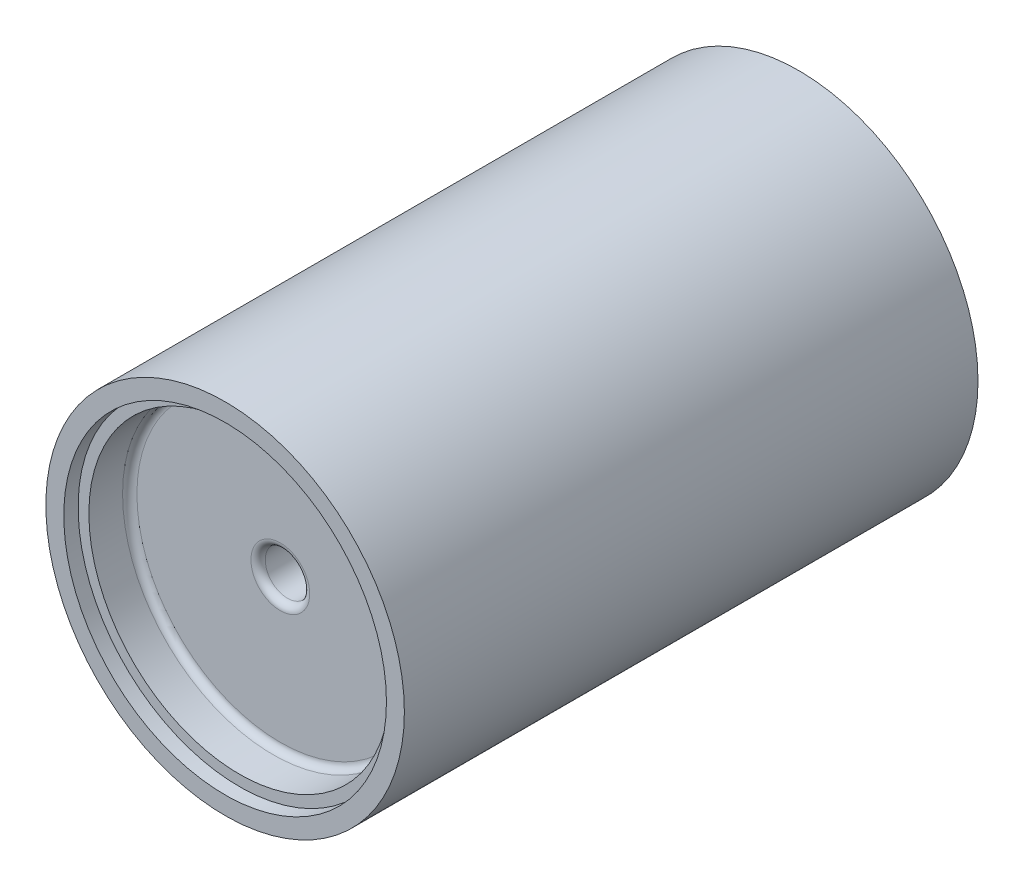
ISO-10303-21;
HEADER;
FILE_DESCRIPTION(('STEP AP214'),'2;1');
FILE_NAME('part.step','',(''),(''),'','','');
FILE_SCHEMA(('AUTOMOTIVE_DESIGN { 1 0 10303 214 1 1 1 1 }'));
ENDSEC;
DATA;
#1=APPLICATION_CONTEXT('core data for automotive mechanical design processes');
#2=APPLICATION_PROTOCOL_DEFINITION('international standard','automotive_design',2000,#1);
#3=PRODUCT_CONTEXT('',#1,'mechanical');
#4=PRODUCT('Part','Part','',(#3));
#5=PRODUCT_RELATED_PRODUCT_CATEGORY('part','',(#4));
#6=PRODUCT_DEFINITION_FORMATION('','',#4);
#7=PRODUCT_DEFINITION_CONTEXT('part definition',#1,'design');
#8=PRODUCT_DEFINITION('design','',#6,#7);
#9=PRODUCT_DEFINITION_SHAPE('','',#8);
#10=(LENGTH_UNIT() NAMED_UNIT(*) SI_UNIT(.MILLI.,.METRE.));
#11=(NAMED_UNIT(*) PLANE_ANGLE_UNIT() SI_UNIT($,.RADIAN.));
#12=(NAMED_UNIT(*) SI_UNIT($,.STERADIAN.) SOLID_ANGLE_UNIT());
#13=UNCERTAINTY_MEASURE_WITH_UNIT(LENGTH_MEASURE(1.E-05),#10,'distance_accuracy_value','');
#14=(GEOMETRIC_REPRESENTATION_CONTEXT(3) GLOBAL_UNCERTAINTY_ASSIGNED_CONTEXT((#13)) GLOBAL_UNIT_ASSIGNED_CONTEXT((#10,
#11,#12)) REPRESENTATION_CONTEXT('',''));
#15=CARTESIAN_POINT('',(0.,0.,0.));
#16=DIRECTION('',(0.,0.,1.));
#17=DIRECTION('',(1.,0.,0.));
#18=AXIS2_PLACEMENT_3D('',#15,#16,#17);
#19=CARTESIAN_POINT('',(0.,0.,-32.3));
#20=DIRECTION('',(0.,0.,-1.));
#21=DIRECTION('',(-1.,0.,0.));
#22=AXIS2_PLACEMENT_3D('',#19,#20,#21);
#23=CYLINDRICAL_SURFACE('',#22,21.);
#24=CARTESIAN_POINT('',(0.,0.,-33.3));
#25=DIRECTION('',(0.,0.,-1.));
#26=DIRECTION('',(-1.,0.,0.));
#27=AXIS2_PLACEMENT_3D('',#24,#25,#26);
#28=CIRCLE('',#27,21.);
#29=CARTESIAN_POINT('',(-21.,0.,-33.3));
#30=VERTEX_POINT('',#29);
#31=EDGE_CURVE('E48',#30,#30,#28,.F.);
#32=CARTESIAN_POINT('',(0.,0.,-38.));
#33=DIRECTION('',(0.,0.,-1.));
#34=DIRECTION('',(-1.,0.,0.));
#35=AXIS2_PLACEMENT_3D('',#32,#33,#34);
#36=CIRCLE('',#35,21.);
#37=CARTESIAN_POINT('',(-21.,0.,-38.));
#38=VERTEX_POINT('',#37);
#39=EDGE_CURVE('E92',#38,#38,#36,.T.);
#40=CARTESIAN_POINT('',(-21.,0.,-33.3));
#41=CARTESIAN_POINT('',(-21.,0.,-33.3489583333333));
#42=CARTESIAN_POINT('',(-21.,0.,-33.3979166666667));
#43=CARTESIAN_POINT('',(-21.,0.,-33.4958333333333));
#44=CARTESIAN_POINT('',(-21.,0.,-33.5447916666667));
#45=CARTESIAN_POINT('',(-21.,0.,-33.6427083333333));
#46=CARTESIAN_POINT('',(-21.,0.,-33.6916666666667));
#47=CARTESIAN_POINT('',(-21.,0.,-33.7895833333333));
#48=CARTESIAN_POINT('',(-21.,0.,-33.8385416666667));
#49=CARTESIAN_POINT('',(-21.,0.,-33.9364583333333));
#50=CARTESIAN_POINT('',(-21.,0.,-33.9854166666667));
#51=CARTESIAN_POINT('',(-21.,0.,-34.0833333333333));
#52=CARTESIAN_POINT('',(-21.,0.,-34.1322916666667));
#53=CARTESIAN_POINT('',(-21.,0.,-34.2302083333333));
#54=CARTESIAN_POINT('',(-21.,0.,-34.2791666666667));
#55=CARTESIAN_POINT('',(-21.,0.,-34.3770833333333));
#56=CARTESIAN_POINT('',(-21.,0.,-34.4260416666667));
#57=CARTESIAN_POINT('',(-21.,0.,-34.5239583333333));
#58=CARTESIAN_POINT('',(-21.,0.,-34.5729166666667));
#59=CARTESIAN_POINT('',(-21.,0.,-34.6708333333333));
#60=CARTESIAN_POINT('',(-21.,0.,-34.7197916666667));
#61=CARTESIAN_POINT('',(-21.,0.,-34.8177083333333));
#62=CARTESIAN_POINT('',(-21.,0.,-34.8666666666667));
#63=CARTESIAN_POINT('',(-21.,0.,-34.9645833333333));
#64=CARTESIAN_POINT('',(-21.,0.,-35.0135416666667));
#65=CARTESIAN_POINT('',(-21.,0.,-35.1114583333333));
#66=CARTESIAN_POINT('',(-21.,0.,-35.1604166666667));
#67=CARTESIAN_POINT('',(-21.,0.,-35.2583333333333));
#68=CARTESIAN_POINT('',(-21.,0.,-35.3072916666667));
#69=CARTESIAN_POINT('',(-21.,0.,-35.4052083333333));
#70=CARTESIAN_POINT('',(-21.,0.,-35.4541666666667));
#71=CARTESIAN_POINT('',(-21.,0.,-35.5520833333333));
#72=CARTESIAN_POINT('',(-21.,0.,-35.6010416666667));
#73=CARTESIAN_POINT('',(-21.,0.,-35.6989583333333));
#74=CARTESIAN_POINT('',(-21.,0.,-35.7479166666667));
#75=CARTESIAN_POINT('',(-21.,0.,-35.8458333333333));
#76=CARTESIAN_POINT('',(-21.,0.,-35.8947916666667));
#77=CARTESIAN_POINT('',(-21.,0.,-35.9927083333333));
#78=CARTESIAN_POINT('',(-21.,0.,-36.0416666666667));
#79=CARTESIAN_POINT('',(-21.,0.,-36.1395833333333));
#80=CARTESIAN_POINT('',(-21.,0.,-36.1885416666667));
#81=CARTESIAN_POINT('',(-21.,0.,-36.2864583333333));
#82=CARTESIAN_POINT('',(-21.,0.,-36.3354166666667));
#83=CARTESIAN_POINT('',(-21.,0.,-36.4333333333333));
#84=CARTESIAN_POINT('',(-21.,0.,-36.4822916666667));
#85=CARTESIAN_POINT('',(-21.,0.,-36.5802083333333));
#86=CARTESIAN_POINT('',(-21.,0.,-36.6291666666667));
#87=CARTESIAN_POINT('',(-21.,0.,-36.7270833333333));
#88=CARTESIAN_POINT('',(-21.,0.,-36.7760416666667));
#89=CARTESIAN_POINT('',(-21.,0.,-36.8739583333333));
#90=CARTESIAN_POINT('',(-21.,0.,-36.9229166666667));
#91=CARTESIAN_POINT('',(-21.,0.,-37.0208333333333));
#92=CARTESIAN_POINT('',(-21.,0.,-37.0697916666667));
#93=CARTESIAN_POINT('',(-21.,0.,-37.1677083333333));
#94=CARTESIAN_POINT('',(-21.,0.,-37.2166666666667));
#95=CARTESIAN_POINT('',(-21.,0.,-37.3145833333333));
#96=CARTESIAN_POINT('',(-21.,0.,-37.3635416666667));
#97=CARTESIAN_POINT('',(-21.,0.,-37.4614583333333));
#98=CARTESIAN_POINT('',(-21.,0.,-37.5104166666667));
#99=CARTESIAN_POINT('',(-21.,0.,-37.6083333333333));
#100=CARTESIAN_POINT('',(-21.,0.,-37.6572916666667));
#101=CARTESIAN_POINT('',(-21.,0.,-37.7552083333333));
#102=CARTESIAN_POINT('',(-21.,0.,-37.8041666666667));
#103=CARTESIAN_POINT('',(-21.,0.,-37.9020833333333));
#104=CARTESIAN_POINT('',(-21.,0.,-37.9510416666667));
#105=CARTESIAN_POINT('',(-21.,0.,-38.));
#106=B_SPLINE_CURVE_WITH_KNOTS('',3,(#40,#41,#42,#43,#44,#45,#46,#47,#48,#49,#50,#51,#52,#53,
#54,#55,#56,#57,#58,#59,#60,#61,#62,#63,#64,#65,#66,#67,#68,#69,#70,#71,#72,#73,#74,#75,#76,#77,
#78,#79,#80,#81,#82,#83,#84,#85,#86,#87,#88,#89,#90,#91,#92,#93,#94,#95,#96,#97,#98,#99,#100,
#101,#102,#103,#104,#105),.UNSPECIFIED.,.F.,.F.,(4,2,2,2,2,2,2,2,2,2,2,2,2,2,2,2,2,2,2,2,2,2,2,
2,2,2,2,2,2,2,2,2,4),(0.,0.146874999999998,0.293749999999995,0.440624999999993,
0.587499999999998,0.734374999999995,0.881249999999993,1.028125,1.175,1.32187499999999,1.46875,
1.615625,1.76249999999999,1.909375,2.05625,2.20312499999999,2.35,2.496875,2.64374999999999,
2.790625,2.9375,3.08437499999999,3.23125,3.378125,3.52499999999999,3.67187499999999,3.81875,
3.96562499999999,4.11249999999999,4.259375,4.40624999999999,4.55312499999999,4.7),.UNSPECIFIED.);
#107=EDGE_CURVE('BSEAM41',#30,#38,#106,.T.);
#108=ORIENTED_EDGE('',*,*,#31,.T.);
#109=ORIENTED_EDGE('',*,*,#39,.T.);
#110=ORIENTED_EDGE('',*,*,#107,.T.);
#111=ORIENTED_EDGE('',*,*,#107,.F.);
#112=EDGE_LOOP('',(#108,#110,#109,#111));
#113=FACE_BOUND('',#112,.T.);
#114=ADVANCED_FACE('F41',(#113),#23,.F.);
#115=CARTESIAN_POINT('',(0.,0.,32.3));
#116=DIRECTION('',(0.,0.,1.));
#117=DIRECTION('',(1.,0.,0.));
#118=AXIS2_PLACEMENT_3D('',#115,#116,#117);
#119=CYLINDRICAL_SURFACE('',#118,21.);
#120=CARTESIAN_POINT('',(0.,0.,33.3));
#121=DIRECTION('',(0.,0.,1.));
#122=DIRECTION('',(1.,0.,0.));
#123=AXIS2_PLACEMENT_3D('',#120,#121,#122);
#124=CIRCLE('',#123,21.);
#125=CARTESIAN_POINT('',(21.,0.,33.3));
#126=VERTEX_POINT('',#125);
#127=EDGE_CURVE('E10',#126,#126,#124,.F.);
#128=CARTESIAN_POINT('',(0.,0.,38.));
#129=DIRECTION('',(0.,0.,1.));
#130=DIRECTION('',(1.,0.,0.));
#131=AXIS2_PLACEMENT_3D('',#128,#129,#130);
#132=CIRCLE('',#131,21.);
#133=CARTESIAN_POINT('',(21.,0.,38.));
#134=VERTEX_POINT('',#133);
#135=EDGE_CURVE('E83',#134,#134,#132,.T.);
#136=CARTESIAN_POINT('',(21.,0.,33.3));
#137=CARTESIAN_POINT('',(21.,0.,33.3489583333333));
#138=CARTESIAN_POINT('',(21.,0.,33.3979166666667));
#139=CARTESIAN_POINT('',(21.,0.,33.4958333333333));
#140=CARTESIAN_POINT('',(21.,0.,33.5447916666667));
#141=CARTESIAN_POINT('',(21.,0.,33.6427083333333));
#142=CARTESIAN_POINT('',(21.,0.,33.6916666666667));
#143=CARTESIAN_POINT('',(21.,0.,33.7895833333333));
#144=CARTESIAN_POINT('',(21.,0.,33.8385416666667));
#145=CARTESIAN_POINT('',(21.,0.,33.9364583333333));
#146=CARTESIAN_POINT('',(21.,0.,33.9854166666667));
#147=CARTESIAN_POINT('',(21.,0.,34.0833333333333));
#148=CARTESIAN_POINT('',(21.,0.,34.1322916666667));
#149=CARTESIAN_POINT('',(21.,0.,34.2302083333333));
#150=CARTESIAN_POINT('',(21.,0.,34.2791666666667));
#151=CARTESIAN_POINT('',(21.,0.,34.3770833333333));
#152=CARTESIAN_POINT('',(21.,0.,34.4260416666667));
#153=CARTESIAN_POINT('',(21.,0.,34.5239583333333));
#154=CARTESIAN_POINT('',(21.,0.,34.5729166666667));
#155=CARTESIAN_POINT('',(21.,0.,34.6708333333333));
#156=CARTESIAN_POINT('',(21.,0.,34.7197916666667));
#157=CARTESIAN_POINT('',(21.,0.,34.8177083333333));
#158=CARTESIAN_POINT('',(21.,0.,34.8666666666667));
#159=CARTESIAN_POINT('',(21.,0.,34.9645833333333));
#160=CARTESIAN_POINT('',(21.,0.,35.0135416666667));
#161=CARTESIAN_POINT('',(21.,0.,35.1114583333333));
#162=CARTESIAN_POINT('',(21.,0.,35.1604166666667));
#163=CARTESIAN_POINT('',(21.,0.,35.2583333333333));
#164=CARTESIAN_POINT('',(21.,0.,35.3072916666667));
#165=CARTESIAN_POINT('',(21.,0.,35.4052083333333));
#166=CARTESIAN_POINT('',(21.,0.,35.4541666666667));
#167=CARTESIAN_POINT('',(21.,0.,35.5520833333333));
#168=CARTESIAN_POINT('',(21.,0.,35.6010416666667));
#169=CARTESIAN_POINT('',(21.,0.,35.6989583333333));
#170=CARTESIAN_POINT('',(21.,0.,35.7479166666667));
#171=CARTESIAN_POINT('',(21.,0.,35.8458333333333));
#172=CARTESIAN_POINT('',(21.,0.,35.8947916666667));
#173=CARTESIAN_POINT('',(21.,0.,35.9927083333333));
#174=CARTESIAN_POINT('',(21.,0.,36.0416666666667));
#175=CARTESIAN_POINT('',(21.,0.,36.1395833333333));
#176=CARTESIAN_POINT('',(21.,0.,36.1885416666667));
#177=CARTESIAN_POINT('',(21.,0.,36.2864583333333));
#178=CARTESIAN_POINT('',(21.,0.,36.3354166666667));
#179=CARTESIAN_POINT('',(21.,0.,36.4333333333333));
#180=CARTESIAN_POINT('',(21.,0.,36.4822916666667));
#181=CARTESIAN_POINT('',(21.,0.,36.5802083333333));
#182=CARTESIAN_POINT('',(21.,0.,36.6291666666667));
#183=CARTESIAN_POINT('',(21.,0.,36.7270833333333));
#184=CARTESIAN_POINT('',(21.,0.,36.7760416666667));
#185=CARTESIAN_POINT('',(21.,0.,36.8739583333333));
#186=CARTESIAN_POINT('',(21.,0.,36.9229166666667));
#187=CARTESIAN_POINT('',(21.,0.,37.0208333333333));
#188=CARTESIAN_POINT('',(21.,0.,37.0697916666667));
#189=CARTESIAN_POINT('',(21.,0.,37.1677083333333));
#190=CARTESIAN_POINT('',(21.,0.,37.2166666666667));
#191=CARTESIAN_POINT('',(21.,0.,37.3145833333333));
#192=CARTESIAN_POINT('',(21.,0.,37.3635416666667));
#193=CARTESIAN_POINT('',(21.,0.,37.4614583333333));
#194=CARTESIAN_POINT('',(21.,0.,37.5104166666667));
#195=CARTESIAN_POINT('',(21.,0.,37.6083333333333));
#196=CARTESIAN_POINT('',(21.,0.,37.6572916666667));
#197=CARTESIAN_POINT('',(21.,0.,37.7552083333333));
#198=CARTESIAN_POINT('',(21.,0.,37.8041666666667));
#199=CARTESIAN_POINT('',(21.,0.,37.9020833333333));
#200=CARTESIAN_POINT('',(21.,0.,37.9510416666667));
#201=CARTESIAN_POINT('',(21.,0.,38.));
#202=B_SPLINE_CURVE_WITH_KNOTS('',3,(#136,#137,#138,#139,#140,#141,#142,#143,#144,#145,#146,
#147,#148,#149,#150,#151,#152,#153,#154,#155,#156,#157,#158,#159,#160,#161,#162,#163,#164,#165,
#166,#167,#168,#169,#170,#171,#172,#173,#174,#175,#176,#177,#178,#179,#180,#181,#182,#183,#184,
#185,#186,#187,#188,#189,#190,#191,#192,#193,#194,#195,#196,#197,#198,#199,#200,#201),
.UNSPECIFIED.,.F.,.F.,(4,2,2,2,2,2,2,2,2,2,2,2,2,2,2,2,2,2,2,2,2,2,2,2,2,2,2,2,2,2,2,2,4),(0.,
0.146874999999998,0.293749999999995,0.440624999999993,0.587499999999998,0.734374999999995,
0.881249999999993,1.028125,1.175,1.32187499999999,1.46875,1.615625,1.76249999999999,1.909375,
2.05625,2.20312499999999,2.35,2.496875,2.64374999999999,2.790625,2.9375,3.08437499999999,
3.23125,3.378125,3.52499999999999,3.67187499999999,3.81875,3.96562499999999,4.11249999999999,
4.259375,4.40624999999999,4.55312499999999,4.7),.UNSPECIFIED.);
#203=EDGE_CURVE('BSEAM133',#126,#134,#202,.T.);
#204=ORIENTED_EDGE('',*,*,#127,.T.);
#205=ORIENTED_EDGE('',*,*,#135,.T.);
#206=ORIENTED_EDGE('',*,*,#203,.T.);
#207=ORIENTED_EDGE('',*,*,#203,.F.);
#208=EDGE_LOOP('',(#204,#206,#205,#207));
#209=FACE_BOUND('',#208,.T.);
#210=ADVANCED_FACE('F133',(#209),#119,.F.);
#211=CARTESIAN_POINT('',(0.,0.,40.));
#212=DIRECTION('',(0.,0.,-1.));
#213=DIRECTION('',(-1.,0.,0.));
#214=AXIS2_PLACEMENT_3D('',#211,#212,#213);
#215=CYLINDRICAL_SURFACE('',#214,3.1);
#216=CARTESIAN_POINT('',(0.,0.,-31.3));
#217=DIRECTION('',(0.,0.,-1.));
#218=DIRECTION('',(-1.,0.,0.));
#219=AXIS2_PLACEMENT_3D('',#216,#217,#218);
#220=CIRCLE('',#219,3.1);
#221=CARTESIAN_POINT('',(-3.1,0.,-31.3));
#222=VERTEX_POINT('',#221);
#223=EDGE_CURVE('E67',#222,#222,#220,.T.);
#224=ORIENTED_EDGE('',*,*,#223,.T.);
#225=EDGE_LOOP('',(#224));
#226=FACE_BOUND('',#225,.T.);
#227=CARTESIAN_POINT('',(0.,0.,31.3));
#228=DIRECTION('',(0.,0.,1.));
#229=DIRECTION('',(1.,0.,0.));
#230=AXIS2_PLACEMENT_3D('',#227,#228,#229);
#231=CIRCLE('',#230,3.1);
#232=CARTESIAN_POINT('',(3.1,0.,31.3));
#233=VERTEX_POINT('',#232);
#234=EDGE_CURVE('E70',#233,#233,#231,.T.);
#235=ORIENTED_EDGE('',*,*,#234,.T.);
#236=EDGE_LOOP('',(#235));
#237=FACE_BOUND('',#236,.T.);
#238=ADVANCED_FACE('F138',(#226,#237),#215,.F.);
#239=CARTESIAN_POINT('',(0.,0.,40.));
#240=DIRECTION('',(0.,0.,1.));
#241=DIRECTION('',(1.,0.,0.));
#242=AXIS2_PLACEMENT_3D('',#239,#240,#241);
#243=PLANE('',#242);
#244=CARTESIAN_POINT('',(0.,0.,40.));
#245=DIRECTION('',(0.,0.,1.));
#246=DIRECTION('',(1.,0.,0.));
#247=AXIS2_PLACEMENT_3D('',#244,#245,#246);
#248=CIRCLE('',#247,22.5);
#249=CARTESIAN_POINT('',(22.5,0.,40.));
#250=VERTEX_POINT('',#249);
#251=EDGE_CURVE('E80',#250,#250,#248,.T.);
#252=ORIENTED_EDGE('',*,*,#251,.F.);
#253=EDGE_LOOP('',(#252));
#254=FACE_BOUND('',#253,.T.);
#255=CARTESIAN_POINT('',(0.,0.,40.));
#256=DIRECTION('',(0.,0.,1.));
#257=DIRECTION('',(1.,0.,0.));
#258=AXIS2_PLACEMENT_3D('',#255,#256,#257);
#259=CIRCLE('',#258,25.);
#260=CARTESIAN_POINT('',(25.,0.,40.));
#261=VERTEX_POINT('',#260);
#262=EDGE_CURVE('E73',#261,#261,#259,.T.);
#263=ORIENTED_EDGE('',*,*,#262,.T.);
#264=EDGE_LOOP('',(#263));
#265=FACE_BOUND('',#264,.T.);
#266=ADVANCED_FACE('F116',(#254,#265),#243,.T.);
#267=CARTESIAN_POINT('',(0.,0.,-40.));
#268=DIRECTION('',(0.,0.,1.));
#269=DIRECTION('',(1.,0.,0.));
#270=AXIS2_PLACEMENT_3D('',#267,#268,#269);
#271=PLANE('',#270);
#272=CARTESIAN_POINT('',(0.,0.,-40.));
#273=DIRECTION('',(0.,0.,-1.));
#274=DIRECTION('',(-1.,0.,0.));
#275=AXIS2_PLACEMENT_3D('',#272,#273,#274);
#276=CIRCLE('',#275,22.5);
#277=CARTESIAN_POINT('',(-22.5,0.,-40.));
#278=VERTEX_POINT('',#277);
#279=EDGE_CURVE('E89',#278,#278,#276,.T.);
#280=ORIENTED_EDGE('',*,*,#279,.F.);
#281=EDGE_LOOP('',(#280));
#282=FACE_BOUND('',#281,.T.);
#283=CARTESIAN_POINT('',(0.,0.,-40.));
#284=DIRECTION('',(0.,0.,1.));
#285=DIRECTION('',(1.,0.,0.));
#286=AXIS2_PLACEMENT_3D('',#283,#284,#285);
#287=CIRCLE('',#286,25.);
#288=CARTESIAN_POINT('',(25.,0.,-40.));
#289=VERTEX_POINT('',#288);
#290=EDGE_CURVE('E74',#289,#289,#287,.T.);
#291=ORIENTED_EDGE('',*,*,#290,.F.);
#292=EDGE_LOOP('',(#291));
#293=FACE_BOUND('',#292,.T.);
#294=ADVANCED_FACE('F112',(#282,#293),#271,.F.);
#295=CARTESIAN_POINT('',(0.,0.,40.));
#296=DIRECTION('',(0.,0.,-1.));
#297=DIRECTION('',(-1.,0.,0.));
#298=AXIS2_PLACEMENT_3D('',#295,#296,#297);
#299=CYLINDRICAL_SURFACE('',#298,25.);
#300=ORIENTED_EDGE('',*,*,#262,.F.);
#301=EDGE_LOOP('',(#300));
#302=FACE_BOUND('',#301,.T.);
#303=ORIENTED_EDGE('',*,*,#290,.T.);
#304=EDGE_LOOP('',(#303));
#305=FACE_BOUND('',#304,.T.);
#306=ADVANCED_FACE('F115',(#302,#305),#299,.T.);
#307=CARTESIAN_POINT('',(0.,0.,32.3));
#308=DIRECTION('',(0.,0.,1.));
#309=DIRECTION('',(1.,0.,0.));
#310=AXIS2_PLACEMENT_3D('',#307,#308,#309);
#311=PLANE('',#310);
#312=CARTESIAN_POINT('',(0.,0.,32.3));
#313=DIRECTION('',(0.,0.,1.));
#314=DIRECTION('',(1.,0.,0.));
#315=AXIS2_PLACEMENT_3D('',#312,#313,#314);
#316=CIRCLE('',#315,4.1);
#317=CARTESIAN_POINT('',(4.1,0.,32.3));
#318=VERTEX_POINT('',#317);
#319=EDGE_CURVE('E52',#318,#318,#316,.F.);
#320=ORIENTED_EDGE('',*,*,#319,.T.);
#321=EDGE_LOOP('',(#320));
#322=FACE_BOUND('',#321,.T.);
#323=CARTESIAN_POINT('',(0.,0.,32.3));
#324=DIRECTION('',(0.,0.,1.));
#325=DIRECTION('',(1.,0.,0.));
#326=AXIS2_PLACEMENT_3D('',#323,#324,#325);
#327=CIRCLE('',#326,20.);
#328=CARTESIAN_POINT('',(20.,0.,32.3));
#329=VERTEX_POINT('',#328);
#330=EDGE_CURVE('E56',#329,#329,#327,.T.);
#331=ORIENTED_EDGE('',*,*,#330,.T.);
#332=EDGE_LOOP('',(#331));
#333=FACE_BOUND('',#332,.T.);
#334=ADVANCED_FACE('F121',(#322,#333),#311,.T.);
#335=CARTESIAN_POINT('',(0.,0.,-32.3));
#336=DIRECTION('',(0.,0.,-1.));
#337=DIRECTION('',(-1.,0.,0.));
#338=AXIS2_PLACEMENT_3D('',#335,#336,#337);
#339=PLANE('',#338);
#340=CARTESIAN_POINT('',(0.,0.,-32.3));
#341=DIRECTION('',(0.,0.,-1.));
#342=DIRECTION('',(-1.,0.,0.));
#343=AXIS2_PLACEMENT_3D('',#340,#341,#342);
#344=CIRCLE('',#343,4.1);
#345=CARTESIAN_POINT('',(-4.1,0.,-32.3));
#346=VERTEX_POINT('',#345);
#347=EDGE_CURVE('E61',#346,#346,#344,.F.);
#348=ORIENTED_EDGE('',*,*,#347,.T.);
#349=EDGE_LOOP('',(#348));
#350=FACE_BOUND('',#349,.T.);
#351=CARTESIAN_POINT('',(0.,0.,-32.3));
#352=DIRECTION('',(0.,0.,-1.));
#353=DIRECTION('',(-1.,0.,0.));
#354=AXIS2_PLACEMENT_3D('',#351,#352,#353);
#355=CIRCLE('',#354,20.);
#356=CARTESIAN_POINT('',(-20.,0.,-32.3));
#357=VERTEX_POINT('',#356);
#358=EDGE_CURVE('E64',#357,#357,#355,.T.);
#359=ORIENTED_EDGE('',*,*,#358,.T.);
#360=EDGE_LOOP('',(#359));
#361=FACE_BOUND('',#360,.T.);
#362=ADVANCED_FACE('F127',(#350,#361),#339,.T.);
#363=CARTESIAN_POINT('',(0.,0.,-31.3));
#364=DIRECTION('',(0.,0.,-1.));
#365=DIRECTION('',(-1.,0.,0.));
#366=AXIS2_PLACEMENT_3D('',#363,#364,#365);
#367=TOROIDAL_SURFACE('',#366,4.1,1.);
#368=ORIENTED_EDGE('',*,*,#347,.F.);
#369=EDGE_LOOP('',(#368));
#370=FACE_BOUND('',#369,.T.);
#371=ORIENTED_EDGE('',*,*,#223,.F.);
#372=EDGE_LOOP('',(#371));
#373=FACE_BOUND('',#372,.T.);
#374=ADVANCED_FACE('F177',(#370,#373),#367,.T.);
#375=CARTESIAN_POINT('',(0.,0.,31.3));
#376=DIRECTION('',(0.,0.,1.));
#377=DIRECTION('',(1.,0.,0.));
#378=AXIS2_PLACEMENT_3D('',#375,#376,#377);
#379=TOROIDAL_SURFACE('',#378,4.1,1.);
#380=ORIENTED_EDGE('',*,*,#319,.F.);
#381=EDGE_LOOP('',(#380));
#382=FACE_BOUND('',#381,.T.);
#383=ORIENTED_EDGE('',*,*,#234,.F.);
#384=EDGE_LOOP('',(#383));
#385=FACE_BOUND('',#384,.T.);
#386=ADVANCED_FACE('F169',(#382,#385),#379,.T.);
#387=CARTESIAN_POINT('',(0.,0.,-33.3));
#388=DIRECTION('',(0.,0.,-1.));
#389=DIRECTION('',(-1.,0.,0.));
#390=AXIS2_PLACEMENT_3D('',#387,#388,#389);
#391=TOROIDAL_SURFACE('',#390,20.,1.);
#392=ORIENTED_EDGE('',*,*,#31,.F.);
#393=EDGE_LOOP('',(#392));
#394=FACE_BOUND('',#393,.T.);
#395=ORIENTED_EDGE('',*,*,#358,.F.);
#396=EDGE_LOOP('',(#395));
#397=FACE_BOUND('',#396,.T.);
#398=ADVANCED_FACE('F162',(#394,#397),#391,.F.);
#399=CARTESIAN_POINT('',(0.,0.,33.3));
#400=DIRECTION('',(0.,0.,1.));
#401=DIRECTION('',(1.,0.,0.));
#402=AXIS2_PLACEMENT_3D('',#399,#400,#401);
#403=TOROIDAL_SURFACE('',#402,20.,1.);
#404=ORIENTED_EDGE('',*,*,#127,.F.);
#405=EDGE_LOOP('',(#404));
#406=FACE_BOUND('',#405,.T.);
#407=ORIENTED_EDGE('',*,*,#330,.F.);
#408=EDGE_LOOP('',(#407));
#409=FACE_BOUND('',#408,.T.);
#410=ADVANCED_FACE('F43',(#406,#409),#403,.F.);
#411=CARTESIAN_POINT('',(0.,0.,38.));
#412=DIRECTION('',(0.,0.,1.));
#413=DIRECTION('',(1.,0.,0.));
#414=AXIS2_PLACEMENT_3D('',#411,#412,#413);
#415=CYLINDRICAL_SURFACE('',#414,22.5);
#416=CARTESIAN_POINT('',(0.,0.,38.));
#417=DIRECTION('',(0.,0.,1.));
#418=DIRECTION('',(1.,0.,0.));
#419=AXIS2_PLACEMENT_3D('',#416,#417,#418);
#420=CIRCLE('',#419,22.5);
#421=CARTESIAN_POINT('',(22.5,0.,38.));
#422=VERTEX_POINT('',#421);
#423=EDGE_CURVE('E77',#422,#422,#420,.T.);
#424=ORIENTED_EDGE('',*,*,#423,.F.);
#425=EDGE_LOOP('',(#424));
#426=FACE_BOUND('',#425,.T.);
#427=ORIENTED_EDGE('',*,*,#251,.T.);
#428=EDGE_LOOP('',(#427));
#429=FACE_BOUND('',#428,.T.);
#430=ADVANCED_FACE('F153',(#426,#429),#415,.F.);
#431=CARTESIAN_POINT('',(0.,0.,38.));
#432=DIRECTION('',(0.,0.,1.));
#433=DIRECTION('',(1.,0.,0.));
#434=AXIS2_PLACEMENT_3D('',#431,#432,#433);
#435=PLANE('',#434);
#436=ORIENTED_EDGE('',*,*,#135,.F.);
#437=EDGE_LOOP('',(#436));
#438=FACE_BOUND('',#437,.T.);
#439=ORIENTED_EDGE('',*,*,#423,.T.);
#440=EDGE_LOOP('',(#439));
#441=FACE_BOUND('',#440,.T.);
#442=ADVANCED_FACE('F108',(#438,#441),#435,.T.);
#443=CARTESIAN_POINT('',(0.,0.,-38.));
#444=DIRECTION('',(0.,0.,-1.));
#445=DIRECTION('',(-1.,0.,0.));
#446=AXIS2_PLACEMENT_3D('',#443,#444,#445);
#447=CYLINDRICAL_SURFACE('',#446,22.5);
#448=CARTESIAN_POINT('',(0.,0.,-38.));
#449=DIRECTION('',(0.,0.,-1.));
#450=DIRECTION('',(-1.,0.,0.));
#451=AXIS2_PLACEMENT_3D('',#448,#449,#450);
#452=CIRCLE('',#451,22.5);
#453=CARTESIAN_POINT('',(-22.5,0.,-38.));
#454=VERTEX_POINT('',#453);
#455=EDGE_CURVE('E88',#454,#454,#452,.T.);
#456=ORIENTED_EDGE('',*,*,#455,.F.);
#457=EDGE_LOOP('',(#456));
#458=FACE_BOUND('',#457,.T.);
#459=ORIENTED_EDGE('',*,*,#279,.T.);
#460=EDGE_LOOP('',(#459));
#461=FACE_BOUND('',#460,.T.);
#462=ADVANCED_FACE('F102',(#458,#461),#447,.F.);
#463=CARTESIAN_POINT('',(0.,0.,-38.));
#464=DIRECTION('',(0.,0.,-1.));
#465=DIRECTION('',(-1.,0.,0.));
#466=AXIS2_PLACEMENT_3D('',#463,#464,#465);
#467=PLANE('',#466);
#468=ORIENTED_EDGE('',*,*,#39,.F.);
#469=EDGE_LOOP('',(#468));
#470=FACE_BOUND('',#469,.T.);
#471=ORIENTED_EDGE('',*,*,#455,.T.);
#472=EDGE_LOOP('',(#471));
#473=FACE_BOUND('',#472,.T.);
#474=ADVANCED_FACE('F99',(#470,#473),#467,.T.);
#475=CLOSED_SHELL('',(#114,#210,#238,#266,#294,#306,#334,#362,#374,#386,#398,#410,#430,#442,
#462,#474));
#476=MANIFOLD_SOLID_BREP('B2',#475);
#477=ADVANCED_BREP_SHAPE_REPRESENTATION('',(#18,#476),#14);
#478=SHAPE_DEFINITION_REPRESENTATION(#9,#477);
ENDSEC;
END-ISO-10303-21;
